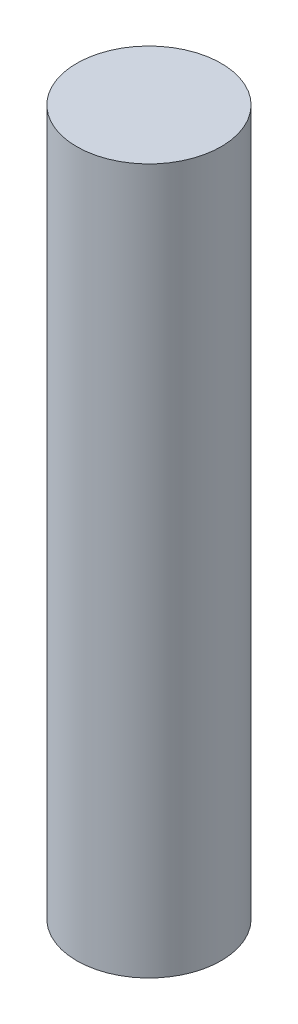
ISO-10303-21;
HEADER;
FILE_DESCRIPTION(('STEP AP214'),'2;1');
FILE_NAME('part.step','',(''),(''),'','','');
FILE_SCHEMA(('AUTOMOTIVE_DESIGN { 1 0 10303 214 1 1 1 1 }'));
ENDSEC;
DATA;
#1=APPLICATION_CONTEXT('core data for automotive mechanical design processes');
#2=APPLICATION_PROTOCOL_DEFINITION('international standard','automotive_design',2000,#1);
#3=PRODUCT_CONTEXT('',#1,'mechanical');
#4=PRODUCT('Part','Part','',(#3));
#5=PRODUCT_RELATED_PRODUCT_CATEGORY('part','',(#4));
#6=PRODUCT_DEFINITION_FORMATION('','',#4);
#7=PRODUCT_DEFINITION_CONTEXT('part definition',#1,'design');
#8=PRODUCT_DEFINITION('design','',#6,#7);
#9=PRODUCT_DEFINITION_SHAPE('','',#8);
#10=(LENGTH_UNIT() NAMED_UNIT(*) SI_UNIT(.MILLI.,.METRE.));
#11=(NAMED_UNIT(*) PLANE_ANGLE_UNIT() SI_UNIT($,.RADIAN.));
#12=(NAMED_UNIT(*) SI_UNIT($,.STERADIAN.) SOLID_ANGLE_UNIT());
#13=UNCERTAINTY_MEASURE_WITH_UNIT(LENGTH_MEASURE(1.E-05),#10,'distance_accuracy_value','');
#14=(GEOMETRIC_REPRESENTATION_CONTEXT(3) GLOBAL_UNCERTAINTY_ASSIGNED_CONTEXT((#13)) GLOBAL_UNIT_ASSIGNED_CONTEXT((#10,
#11,#12)) REPRESENTATION_CONTEXT('',''));
#15=CARTESIAN_POINT('',(0.,0.,0.));
#16=DIRECTION('',(0.,0.,1.));
#17=DIRECTION('',(1.,0.,0.));
#18=AXIS2_PLACEMENT_3D('',#15,#16,#17);
#19=CARTESIAN_POINT('',(0.,-45.,0.));
#20=DIRECTION('',(0.,1.,0.));
#21=DIRECTION('',(0.,0.,1.));
#22=AXIS2_PLACEMENT_3D('',#19,#20,#21);
#23=CYLINDRICAL_SURFACE('',#22,12.5);
#24=CARTESIAN_POINT('',(0.,-45.,0.));
#25=DIRECTION('',(0.,1.,0.));
#26=DIRECTION('',(0.,0.,1.));
#27=AXIS2_PLACEMENT_3D('',#24,#25,#26);
#28=CIRCLE('',#27,12.5);
#29=CARTESIAN_POINT('',(0.,-45.,12.5));
#30=VERTEX_POINT('',#29);
#31=EDGE_CURVE('E10',#30,#30,#28,.T.);
#32=CARTESIAN_POINT('',(0.,77.,0.));
#33=DIRECTION('',(0.,1.,0.));
#34=DIRECTION('',(0.,0.,1.));
#35=AXIS2_PLACEMENT_3D('',#32,#33,#34);
#36=CIRCLE('',#35,12.5);
#37=CARTESIAN_POINT('',(0.,77.,12.5));
#38=VERTEX_POINT('',#37);
#39=EDGE_CURVE('E47',#38,#38,#36,.T.);
#40=CARTESIAN_POINT('',(0.,-45.,12.5));
#41=CARTESIAN_POINT('',(0.,-43.7291666666667,12.5));
#42=CARTESIAN_POINT('',(0.,-42.4583333333333,12.5));
#43=CARTESIAN_POINT('',(0.,-39.9166666666667,12.5));
#44=CARTESIAN_POINT('',(0.,-38.6458333333333,12.5));
#45=CARTESIAN_POINT('',(0.,-36.1041666666667,12.5));
#46=CARTESIAN_POINT('',(0.,-34.8333333333333,12.5));
#47=CARTESIAN_POINT('',(0.,-32.2916666666667,12.5));
#48=CARTESIAN_POINT('',(0.,-31.0208333333333,12.5));
#49=CARTESIAN_POINT('',(0.,-28.4791666666667,12.5));
#50=CARTESIAN_POINT('',(0.,-27.2083333333333,12.5));
#51=CARTESIAN_POINT('',(0.,-24.6666666666667,12.5));
#52=CARTESIAN_POINT('',(0.,-23.3958333333333,12.5));
#53=CARTESIAN_POINT('',(0.,-20.8541666666667,12.5));
#54=CARTESIAN_POINT('',(0.,-19.5833333333333,12.5));
#55=CARTESIAN_POINT('',(0.,-17.0416666666667,12.5));
#56=CARTESIAN_POINT('',(0.,-15.7708333333333,12.5));
#57=CARTESIAN_POINT('',(0.,-13.2291666666667,12.5));
#58=CARTESIAN_POINT('',(0.,-11.9583333333333,12.5));
#59=CARTESIAN_POINT('',(0.,-9.41666666666668,12.5));
#60=CARTESIAN_POINT('',(0.,-8.14583333333335,12.5));
#61=CARTESIAN_POINT('',(0.,-5.60416666666668,12.5));
#62=CARTESIAN_POINT('',(0.,-4.33333333333334,12.5));
#63=CARTESIAN_POINT('',(0.,-1.79166666666668,12.5));
#64=CARTESIAN_POINT('',(0.,-0.520833333333345,12.5));
#65=CARTESIAN_POINT('',(0.,2.02083333333332,12.5));
#66=CARTESIAN_POINT('',(0.,3.29166666666665,12.5));
#67=CARTESIAN_POINT('',(0.,5.83333333333332,12.5));
#68=CARTESIAN_POINT('',(0.,7.10416666666665,12.5));
#69=CARTESIAN_POINT('',(0.,9.64583333333332,12.5));
#70=CARTESIAN_POINT('',(0.,10.9166666666667,12.5));
#71=CARTESIAN_POINT('',(0.,13.4583333333333,12.5));
#72=CARTESIAN_POINT('',(0.,14.7291666666667,12.5));
#73=CARTESIAN_POINT('',(0.,17.2708333333333,12.5));
#74=CARTESIAN_POINT('',(0.,18.5416666666667,12.5));
#75=CARTESIAN_POINT('',(0.,21.0833333333333,12.5));
#76=CARTESIAN_POINT('',(0.,22.3541666666666,12.5));
#77=CARTESIAN_POINT('',(0.,24.8958333333333,12.5));
#78=CARTESIAN_POINT('',(0.,26.1666666666667,12.5));
#79=CARTESIAN_POINT('',(0.,28.7083333333333,12.5));
#80=CARTESIAN_POINT('',(0.,29.9791666666667,12.5));
#81=CARTESIAN_POINT('',(0.,32.5208333333333,12.5));
#82=CARTESIAN_POINT('',(0.,33.7916666666667,12.5));
#83=CARTESIAN_POINT('',(0.,36.3333333333333,12.5));
#84=CARTESIAN_POINT('',(0.,37.6041666666667,12.5));
#85=CARTESIAN_POINT('',(0.,40.1458333333333,12.5));
#86=CARTESIAN_POINT('',(0.,41.4166666666667,12.5));
#87=CARTESIAN_POINT('',(0.,43.9583333333333,12.5));
#88=CARTESIAN_POINT('',(0.,45.2291666666667,12.5));
#89=CARTESIAN_POINT('',(0.,47.7708333333333,12.5));
#90=CARTESIAN_POINT('',(0.,49.0416666666667,12.5));
#91=CARTESIAN_POINT('',(0.,51.5833333333333,12.5));
#92=CARTESIAN_POINT('',(0.,52.8541666666666,12.5));
#93=CARTESIAN_POINT('',(0.,55.3958333333333,12.5));
#94=CARTESIAN_POINT('',(0.,56.6666666666667,12.5));
#95=CARTESIAN_POINT('',(0.,59.2083333333333,12.5));
#96=CARTESIAN_POINT('',(0.,60.4791666666667,12.5));
#97=CARTESIAN_POINT('',(0.,63.0208333333333,12.5));
#98=CARTESIAN_POINT('',(0.,64.2916666666666,12.5));
#99=CARTESIAN_POINT('',(0.,66.8333333333333,12.5));
#100=CARTESIAN_POINT('',(0.,68.1041666666667,12.5));
#101=CARTESIAN_POINT('',(0.,70.6458333333333,12.5));
#102=CARTESIAN_POINT('',(0.,71.9166666666667,12.5));
#103=CARTESIAN_POINT('',(0.,74.4583333333333,12.5));
#104=CARTESIAN_POINT('',(0.,75.7291666666667,12.5));
#105=CARTESIAN_POINT('',(0.,77.,12.5));
#106=B_SPLINE_CURVE_WITH_KNOTS('',3,(#40,#41,#42,#43,#44,#45,#46,#47,#48,#49,#50,#51,#52,#53,
#54,#55,#56,#57,#58,#59,#60,#61,#62,#63,#64,#65,#66,#67,#68,#69,#70,#71,#72,#73,#74,#75,#76,#77,
#78,#79,#80,#81,#82,#83,#84,#85,#86,#87,#88,#89,#90,#91,#92,#93,#94,#95,#96,#97,#98,#99,#100,
#101,#102,#103,#104,#105),.UNSPECIFIED.,.F.,.F.,(4,2,2,2,2,2,2,2,2,2,2,2,2,2,2,2,2,2,2,2,2,2,2,
2,2,2,2,2,2,2,2,2,4),(0.,3.8125,7.625,11.4375,15.25,19.0625,22.875,26.6875,30.5,34.3125,38.125,
41.9375,45.75,49.5625,53.375,57.1875,61.,64.8125,68.625,72.4375,76.25,80.0625,83.875,87.6875,
91.5,95.3125,99.125,102.9375,106.75,110.5625,114.375,118.1875,122.),.UNSPECIFIED.);
#107=EDGE_CURVE('BSEAM41',#30,#38,#106,.T.);
#108=ORIENTED_EDGE('',*,*,#31,.T.);
#109=ORIENTED_EDGE('',*,*,#39,.F.);
#110=ORIENTED_EDGE('',*,*,#107,.T.);
#111=ORIENTED_EDGE('',*,*,#107,.F.);
#112=EDGE_LOOP('',(#108,#110,#109,#111));
#113=FACE_BOUND('',#112,.T.);
#114=ADVANCED_FACE('F41',(#113),#23,.T.);
#115=CARTESIAN_POINT('',(0.,-45.,0.));
#116=DIRECTION('',(0.,1.,0.));
#117=DIRECTION('',(0.,0.,1.));
#118=AXIS2_PLACEMENT_3D('',#115,#116,#117);
#119=PLANE('',#118);
#120=ORIENTED_EDGE('',*,*,#31,.F.);
#121=EDGE_LOOP('',(#120));
#122=FACE_BOUND('',#121,.T.);
#123=ADVANCED_FACE('F56',(#122),#119,.F.);
#124=CARTESIAN_POINT('',(0.,77.,0.));
#125=DIRECTION('',(0.,1.,0.));
#126=DIRECTION('',(0.,0.,1.));
#127=AXIS2_PLACEMENT_3D('',#124,#125,#126);
#128=PLANE('',#127);
#129=ORIENTED_EDGE('',*,*,#39,.T.);
#130=EDGE_LOOP('',(#129));
#131=FACE_BOUND('',#130,.T.);
#132=ADVANCED_FACE('F53',(#131),#128,.T.);
#133=CLOSED_SHELL('',(#114,#123,#132));
#134=MANIFOLD_SOLID_BREP('B2',#133);
#135=ADVANCED_BREP_SHAPE_REPRESENTATION('',(#18,#134),#14);
#136=SHAPE_DEFINITION_REPRESENTATION(#9,#135);
ENDSEC;
END-ISO-10303-21;
